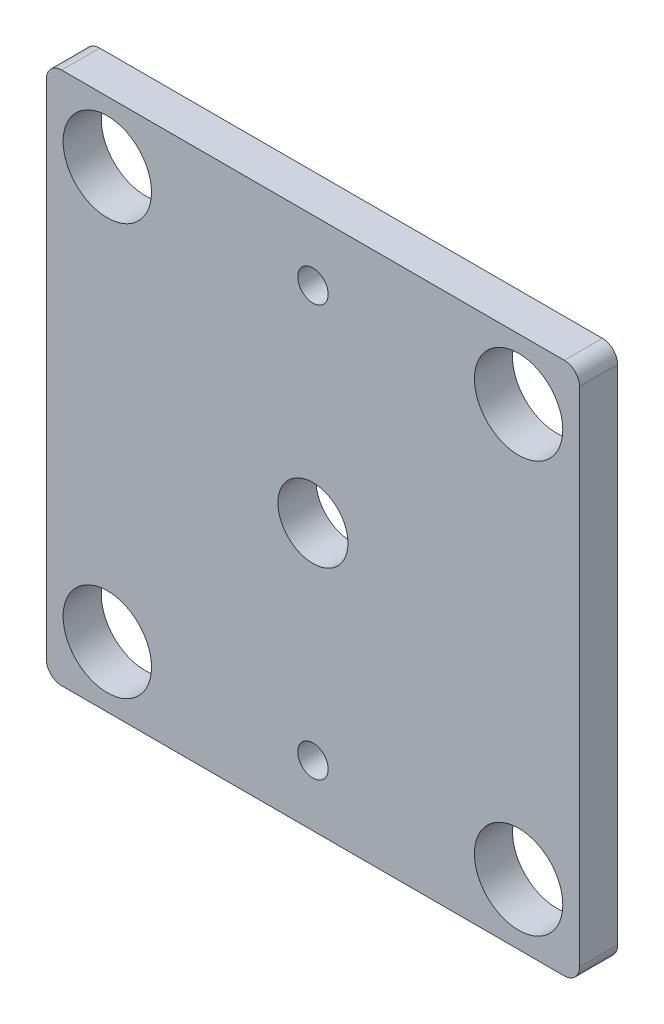
ISO-10303-21;
HEADER;
FILE_DESCRIPTION(('STEP AP214'),'2;1');
FILE_NAME('part.step','',(''),(''),'','','');
FILE_SCHEMA(('AUTOMOTIVE_DESIGN { 1 0 10303 214 1 1 1 1 }'));
ENDSEC;
DATA;
#1=APPLICATION_CONTEXT('core data for automotive mechanical design processes');
#2=APPLICATION_PROTOCOL_DEFINITION('international standard','automotive_design',2000,#1);
#3=PRODUCT_CONTEXT('',#1,'mechanical');
#4=PRODUCT('Part','Part','',(#3));
#5=PRODUCT_RELATED_PRODUCT_CATEGORY('part','',(#4));
#6=PRODUCT_DEFINITION_FORMATION('','',#4);
#7=PRODUCT_DEFINITION_CONTEXT('part definition',#1,'design');
#8=PRODUCT_DEFINITION('design','',#6,#7);
#9=PRODUCT_DEFINITION_SHAPE('','',#8);
#10=(LENGTH_UNIT() NAMED_UNIT(*) SI_UNIT(.MILLI.,.METRE.));
#11=(NAMED_UNIT(*) PLANE_ANGLE_UNIT() SI_UNIT($,.RADIAN.));
#12=(NAMED_UNIT(*) SI_UNIT($,.STERADIAN.) SOLID_ANGLE_UNIT());
#13=UNCERTAINTY_MEASURE_WITH_UNIT(LENGTH_MEASURE(1.E-05),#10,'distance_accuracy_value','');
#14=(GEOMETRIC_REPRESENTATION_CONTEXT(3) GLOBAL_UNCERTAINTY_ASSIGNED_CONTEXT((#13)) GLOBAL_UNIT_ASSIGNED_CONTEXT((#10,
#11,#12)) REPRESENTATION_CONTEXT('',''));
#15=CARTESIAN_POINT('',(0.,0.,0.));
#16=DIRECTION('',(0.,0.,1.));
#17=DIRECTION('',(1.,0.,0.));
#18=AXIS2_PLACEMENT_3D('',#15,#16,#17);
#19=CARTESIAN_POINT('',(0.,0.,5.));
#20=DIRECTION('',(0.,0.,1.));
#21=DIRECTION('',(1.,0.,0.));
#22=AXIS2_PLACEMENT_3D('',#19,#20,#21);
#23=PLANE('',#22);
#24=CARTESIAN_POINT('',(0.,0.,5.));
#25=DIRECTION('',(0.,0.,1.));
#26=DIRECTION('',(1.,0.,0.));
#27=AXIS2_PLACEMENT_3D('',#24,#25,#26);
#28=CIRCLE('',#27,4.6);
#29=CARTESIAN_POINT('',(4.6,0.,5.));
#30=VERTEX_POINT('',#29);
#31=EDGE_CURVE('E205',#30,#30,#28,.T.);
#32=ORIENTED_EDGE('',*,*,#31,.F.);
#33=EDGE_LOOP('',(#32));
#34=FACE_BOUND('',#33,.T.);
#35=CARTESIAN_POINT('',(-27.,-27.,5.));
#36=DIRECTION('',(0.,0.,1.));
#37=DIRECTION('',(1.,0.,0.));
#38=AXIS2_PLACEMENT_3D('',#35,#36,#37);
#39=CIRCLE('',#38,5.8);
#40=CARTESIAN_POINT('',(-21.2,-27.,5.));
#41=VERTEX_POINT('',#40);
#42=EDGE_CURVE('E193',#41,#41,#39,.T.);
#43=ORIENTED_EDGE('',*,*,#42,.F.);
#44=EDGE_LOOP('',(#43));
#45=FACE_BOUND('',#44,.T.);
#46=CARTESIAN_POINT('',(27.,27.,5.));
#47=DIRECTION('',(0.,0.,1.));
#48=DIRECTION('',(1.,0.,0.));
#49=AXIS2_PLACEMENT_3D('',#46,#47,#48);
#50=CIRCLE('',#49,5.8);
#51=CARTESIAN_POINT('',(32.8,27.,5.));
#52=VERTEX_POINT('',#51);
#53=EDGE_CURVE('E182',#52,#52,#50,.T.);
#54=ORIENTED_EDGE('',*,*,#53,.F.);
#55=EDGE_LOOP('',(#54));
#56=FACE_BOUND('',#55,.T.);
#57=DIRECTION('',(0.,-1.,0.));
#58=VECTOR('',#57,1.);
#59=CARTESIAN_POINT('',(-35.,-35.,5.));
#60=LINE('',#59,#58);
#61=CARTESIAN_POINT('',(-35.,33.,5.));
#62=VERTEX_POINT('',#61);
#63=CARTESIAN_POINT('',(-35.,-33.,5.));
#64=VERTEX_POINT('',#63);
#65=EDGE_CURVE('E130',#62,#64,#60,.T.);
#66=ORIENTED_EDGE('',*,*,#65,.T.);
#67=CARTESIAN_POINT('',(-33.,-33.,5.));
#68=DIRECTION('',(0.,0.,1.));
#69=DIRECTION('',(1.,0.,0.));
#70=AXIS2_PLACEMENT_3D('',#67,#68,#69);
#71=CIRCLE('',#70,2.);
#72=CARTESIAN_POINT('',(-33.,-35.,5.));
#73=VERTEX_POINT('',#72);
#74=EDGE_CURVE('E11',#64,#73,#71,.T.);
#75=ORIENTED_EDGE('',*,*,#74,.T.);
#76=DIRECTION('',(1.,0.,0.));
#77=VECTOR('',#76,1.);
#78=CARTESIAN_POINT('',(35.,-35.,5.));
#79=LINE('',#78,#77);
#80=CARTESIAN_POINT('',(33.,-35.,5.));
#81=VERTEX_POINT('',#80);
#82=EDGE_CURVE('E162',#73,#81,#79,.T.);
#83=ORIENTED_EDGE('',*,*,#82,.T.);
#84=CARTESIAN_POINT('',(33.,-33.,5.));
#85=DIRECTION('',(0.,0.,1.));
#86=DIRECTION('',(1.,0.,0.));
#87=AXIS2_PLACEMENT_3D('',#84,#85,#86);
#88=CIRCLE('',#87,2.);
#89=CARTESIAN_POINT('',(35.,-33.,5.));
#90=VERTEX_POINT('',#89);
#91=EDGE_CURVE('E145',#81,#90,#88,.T.);
#92=ORIENTED_EDGE('',*,*,#91,.T.);
#93=DIRECTION('',(0.,1.,0.));
#94=VECTOR('',#93,1.);
#95=CARTESIAN_POINT('',(35.,-35.,5.));
#96=LINE('',#95,#94);
#97=CARTESIAN_POINT('',(35.,33.,5.));
#98=VERTEX_POINT('',#97);
#99=EDGE_CURVE('E119',#90,#98,#96,.T.);
#100=ORIENTED_EDGE('',*,*,#99,.T.);
#101=CARTESIAN_POINT('',(33.,33.,5.));
#102=DIRECTION('',(0.,0.,1.));
#103=DIRECTION('',(1.,0.,0.));
#104=AXIS2_PLACEMENT_3D('',#101,#102,#103);
#105=CIRCLE('',#104,2.);
#106=CARTESIAN_POINT('',(33.,35.,5.));
#107=VERTEX_POINT('',#106);
#108=EDGE_CURVE('E143',#98,#107,#105,.T.);
#109=ORIENTED_EDGE('',*,*,#108,.T.);
#110=DIRECTION('',(-1.,0.,0.));
#111=VECTOR('',#110,1.);
#112=CARTESIAN_POINT('',(35.,35.,5.));
#113=LINE('',#112,#111);
#114=CARTESIAN_POINT('',(-33.,35.,5.));
#115=VERTEX_POINT('',#114);
#116=EDGE_CURVE('E136',#107,#115,#113,.T.);
#117=ORIENTED_EDGE('',*,*,#116,.T.);
#118=CARTESIAN_POINT('',(-33.,33.,5.));
#119=DIRECTION('',(0.,0.,1.));
#120=DIRECTION('',(1.,0.,0.));
#121=AXIS2_PLACEMENT_3D('',#118,#119,#120);
#122=CIRCLE('',#121,2.);
#123=EDGE_CURVE('E141',#115,#62,#122,.T.);
#124=ORIENTED_EDGE('',*,*,#123,.T.);
#125=EDGE_LOOP('',(#66,#75,#83,#92,#100,#109,#117,#124));
#126=FACE_BOUND('',#125,.T.);
#127=CARTESIAN_POINT('',(-27.,27.,5.));
#128=DIRECTION('',(0.,0.,1.));
#129=DIRECTION('',(1.,0.,0.));
#130=AXIS2_PLACEMENT_3D('',#127,#128,#129);
#131=CIRCLE('',#130,5.8);
#132=CARTESIAN_POINT('',(-21.2,27.,5.));
#133=VERTEX_POINT('',#132);
#134=EDGE_CURVE('E177',#133,#133,#131,.T.);
#135=ORIENTED_EDGE('',*,*,#134,.F.);
#136=EDGE_LOOP('',(#135));
#137=FACE_BOUND('',#136,.T.);
#138=CARTESIAN_POINT('',(27.,-27.,5.));
#139=DIRECTION('',(0.,0.,1.));
#140=DIRECTION('',(1.,0.,0.));
#141=AXIS2_PLACEMENT_3D('',#138,#139,#140);
#142=CIRCLE('',#141,5.8);
#143=CARTESIAN_POINT('',(32.8,-27.,5.));
#144=VERTEX_POINT('',#143);
#145=EDGE_CURVE('E187',#144,#144,#142,.T.);
#146=ORIENTED_EDGE('',*,*,#145,.F.);
#147=EDGE_LOOP('',(#146));
#148=FACE_BOUND('',#147,.T.);
#149=CARTESIAN_POINT('',(0.,27.,5.));
#150=DIRECTION('',(0.,0.,1.));
#151=DIRECTION('',(1.,0.,0.));
#152=AXIS2_PLACEMENT_3D('',#149,#150,#151);
#153=CIRCLE('',#152,2.);
#154=CARTESIAN_POINT('',(2.,27.,5.));
#155=VERTEX_POINT('',#154);
#156=EDGE_CURVE('E199',#155,#155,#153,.T.);
#157=ORIENTED_EDGE('',*,*,#156,.F.);
#158=EDGE_LOOP('',(#157));
#159=FACE_BOUND('',#158,.T.);
#160=CARTESIAN_POINT('',(0.,-27.,5.));
#161=DIRECTION('',(0.,0.,1.));
#162=DIRECTION('',(1.,0.,0.));
#163=AXIS2_PLACEMENT_3D('',#160,#161,#162);
#164=CIRCLE('',#163,2.);
#165=CARTESIAN_POINT('',(2.,-27.,5.));
#166=VERTEX_POINT('',#165);
#167=EDGE_CURVE('E211',#166,#166,#164,.T.);
#168=ORIENTED_EDGE('',*,*,#167,.F.);
#169=EDGE_LOOP('',(#168));
#170=FACE_BOUND('',#169,.T.);
#171=ADVANCED_FACE('F36',(#34,#45,#56,#126,#137,#148,#159,#170),#23,.T.);
#172=CARTESIAN_POINT('',(0.,0.,0.));
#173=DIRECTION('',(0.,0.,1.));
#174=DIRECTION('',(1.,0.,0.));
#175=AXIS2_PLACEMENT_3D('',#172,#173,#174);
#176=PLANE('',#175);
#177=DIRECTION('',(1.,0.,0.));
#178=VECTOR('',#177,1.);
#179=CARTESIAN_POINT('',(35.,-35.,0.));
#180=LINE('',#179,#178);
#181=CARTESIAN_POINT('',(-33.,-35.,0.));
#182=VERTEX_POINT('',#181);
#183=CARTESIAN_POINT('',(33.,-35.,0.));
#184=VERTEX_POINT('',#183);
#185=EDGE_CURVE('E127',#182,#184,#180,.T.);
#186=ORIENTED_EDGE('',*,*,#185,.F.);
#187=CARTESIAN_POINT('',(-33.,-33.,0.));
#188=DIRECTION('',(0.,0.,1.));
#189=DIRECTION('',(1.,0.,0.));
#190=AXIS2_PLACEMENT_3D('',#187,#188,#189);
#191=CIRCLE('',#190,2.);
#192=CARTESIAN_POINT('',(-35.,-33.,0.));
#193=VERTEX_POINT('',#192);
#194=EDGE_CURVE('E58',#182,#193,#191,.F.);
#195=ORIENTED_EDGE('',*,*,#194,.T.);
#196=DIRECTION('',(0.,-1.,0.));
#197=VECTOR('',#196,1.);
#198=CARTESIAN_POINT('',(-35.,-35.,0.));
#199=LINE('',#198,#197);
#200=CARTESIAN_POINT('',(-35.,33.,0.));
#201=VERTEX_POINT('',#200);
#202=EDGE_CURVE('E132',#201,#193,#199,.T.);
#203=ORIENTED_EDGE('',*,*,#202,.F.);
#204=CARTESIAN_POINT('',(-33.,33.,0.));
#205=DIRECTION('',(0.,0.,1.));
#206=DIRECTION('',(1.,0.,0.));
#207=AXIS2_PLACEMENT_3D('',#204,#205,#206);
#208=CIRCLE('',#207,2.);
#209=CARTESIAN_POINT('',(-33.,35.,0.));
#210=VERTEX_POINT('',#209);
#211=EDGE_CURVE('E120',#201,#210,#208,.F.);
#212=ORIENTED_EDGE('',*,*,#211,.T.);
#213=DIRECTION('',(-1.,0.,0.));
#214=VECTOR('',#213,1.);
#215=CARTESIAN_POINT('',(35.,35.,0.));
#216=LINE('',#215,#214);
#217=CARTESIAN_POINT('',(33.,35.,0.));
#218=VERTEX_POINT('',#217);
#219=EDGE_CURVE('E126',#218,#210,#216,.T.);
#220=ORIENTED_EDGE('',*,*,#219,.F.);
#221=CARTESIAN_POINT('',(33.,33.,0.));
#222=DIRECTION('',(0.,0.,1.));
#223=DIRECTION('',(1.,0.,0.));
#224=AXIS2_PLACEMENT_3D('',#221,#222,#223);
#225=CIRCLE('',#224,2.);
#226=CARTESIAN_POINT('',(35.,33.,0.));
#227=VERTEX_POINT('',#226);
#228=EDGE_CURVE('E110',#218,#227,#225,.F.);
#229=ORIENTED_EDGE('',*,*,#228,.T.);
#230=DIRECTION('',(0.,1.,0.));
#231=VECTOR('',#230,1.);
#232=CARTESIAN_POINT('',(35.,-35.,0.));
#233=LINE('',#232,#231);
#234=CARTESIAN_POINT('',(35.,-33.,0.));
#235=VERTEX_POINT('',#234);
#236=EDGE_CURVE('E116',#235,#227,#233,.T.);
#237=ORIENTED_EDGE('',*,*,#236,.F.);
#238=CARTESIAN_POINT('',(33.,-33.,0.));
#239=DIRECTION('',(0.,0.,1.));
#240=DIRECTION('',(1.,0.,0.));
#241=AXIS2_PLACEMENT_3D('',#238,#239,#240);
#242=CIRCLE('',#241,2.);
#243=EDGE_CURVE('E102',#235,#184,#242,.F.);
#244=ORIENTED_EDGE('',*,*,#243,.T.);
#245=EDGE_LOOP('',(#186,#195,#203,#212,#220,#229,#237,#244));
#246=FACE_BOUND('',#245,.T.);
#247=CARTESIAN_POINT('',(-27.,27.,0.));
#248=DIRECTION('',(0.,0.,1.));
#249=DIRECTION('',(1.,0.,0.));
#250=AXIS2_PLACEMENT_3D('',#247,#248,#249);
#251=CIRCLE('',#250,5.8);
#252=CARTESIAN_POINT('',(-21.2,27.,0.));
#253=VERTEX_POINT('',#252);
#254=EDGE_CURVE('E173',#253,#253,#251,.T.);
#255=ORIENTED_EDGE('',*,*,#254,.T.);
#256=EDGE_LOOP('',(#255));
#257=FACE_BOUND('',#256,.T.);
#258=CARTESIAN_POINT('',(27.,27.,0.));
#259=DIRECTION('',(0.,0.,1.));
#260=DIRECTION('',(1.,0.,0.));
#261=AXIS2_PLACEMENT_3D('',#258,#259,#260);
#262=CIRCLE('',#261,5.8);
#263=CARTESIAN_POINT('',(32.8,27.,0.));
#264=VERTEX_POINT('',#263);
#265=EDGE_CURVE('E184',#264,#264,#262,.T.);
#266=ORIENTED_EDGE('',*,*,#265,.T.);
#267=EDGE_LOOP('',(#266));
#268=FACE_BOUND('',#267,.T.);
#269=CARTESIAN_POINT('',(27.,-27.,0.));
#270=DIRECTION('',(0.,0.,1.));
#271=DIRECTION('',(1.,0.,0.));
#272=AXIS2_PLACEMENT_3D('',#269,#270,#271);
#273=CIRCLE('',#272,5.8);
#274=CARTESIAN_POINT('',(32.8,-27.,0.));
#275=VERTEX_POINT('',#274);
#276=EDGE_CURVE('E190',#275,#275,#273,.T.);
#277=ORIENTED_EDGE('',*,*,#276,.T.);
#278=EDGE_LOOP('',(#277));
#279=FACE_BOUND('',#278,.T.);
#280=CARTESIAN_POINT('',(-27.,-27.,0.));
#281=DIRECTION('',(0.,0.,1.));
#282=DIRECTION('',(1.,0.,0.));
#283=AXIS2_PLACEMENT_3D('',#280,#281,#282);
#284=CIRCLE('',#283,5.8);
#285=CARTESIAN_POINT('',(-21.2,-27.,0.));
#286=VERTEX_POINT('',#285);
#287=EDGE_CURVE('E196',#286,#286,#284,.T.);
#288=ORIENTED_EDGE('',*,*,#287,.T.);
#289=EDGE_LOOP('',(#288));
#290=FACE_BOUND('',#289,.T.);
#291=CARTESIAN_POINT('',(0.,27.,0.));
#292=DIRECTION('',(0.,0.,1.));
#293=DIRECTION('',(1.,0.,0.));
#294=AXIS2_PLACEMENT_3D('',#291,#292,#293);
#295=CIRCLE('',#294,2.);
#296=CARTESIAN_POINT('',(2.,27.,0.));
#297=VERTEX_POINT('',#296);
#298=EDGE_CURVE('E202',#297,#297,#295,.T.);
#299=ORIENTED_EDGE('',*,*,#298,.T.);
#300=EDGE_LOOP('',(#299));
#301=FACE_BOUND('',#300,.T.);
#302=CARTESIAN_POINT('',(0.,0.,0.));
#303=DIRECTION('',(0.,0.,1.));
#304=DIRECTION('',(1.,0.,0.));
#305=AXIS2_PLACEMENT_3D('',#302,#303,#304);
#306=CIRCLE('',#305,4.6);
#307=CARTESIAN_POINT('',(4.6,0.,0.));
#308=VERTEX_POINT('',#307);
#309=EDGE_CURVE('E208',#308,#308,#306,.T.);
#310=ORIENTED_EDGE('',*,*,#309,.T.);
#311=EDGE_LOOP('',(#310));
#312=FACE_BOUND('',#311,.T.);
#313=CARTESIAN_POINT('',(0.,-27.,0.));
#314=DIRECTION('',(0.,0.,1.));
#315=DIRECTION('',(1.,0.,0.));
#316=AXIS2_PLACEMENT_3D('',#313,#314,#315);
#317=CIRCLE('',#316,2.);
#318=CARTESIAN_POINT('',(2.,-27.,0.));
#319=VERTEX_POINT('',#318);
#320=EDGE_CURVE('E214',#319,#319,#317,.T.);
#321=ORIENTED_EDGE('',*,*,#320,.T.);
#322=EDGE_LOOP('',(#321));
#323=FACE_BOUND('',#322,.T.);
#324=ADVANCED_FACE('F123',(#246,#257,#268,#279,#290,#301,#312,#323),#176,.F.);
#325=CARTESIAN_POINT('',(-35.,-35.,5.));
#326=DIRECTION('',(1.,0.,0.));
#327=DIRECTION('',(0.,0.,-1.));
#328=AXIS2_PLACEMENT_3D('',#325,#326,#327);
#329=PLANE('',#328);
#330=ORIENTED_EDGE('',*,*,#202,.T.);
#331=DIRECTION('',(0.,0.,-1.));
#332=VECTOR('',#331,1.);
#333=CARTESIAN_POINT('',(-35.,-33.,5.));
#334=LINE('',#333,#332);
#335=EDGE_CURVE('E44',#193,#64,#334,.F.);
#336=ORIENTED_EDGE('',*,*,#335,.T.);
#337=ORIENTED_EDGE('',*,*,#65,.F.);
#338=DIRECTION('',(0.,0.,-1.));
#339=VECTOR('',#338,1.);
#340=CARTESIAN_POINT('',(-35.,33.,5.));
#341=LINE('',#340,#339);
#342=EDGE_CURVE('E152',#62,#201,#341,.T.);
#343=ORIENTED_EDGE('',*,*,#342,.T.);
#344=EDGE_LOOP('',(#330,#336,#337,#343));
#345=FACE_BOUND('',#344,.T.);
#346=ADVANCED_FACE('F229',(#345),#329,.F.);
#347=CARTESIAN_POINT('',(35.,-35.,5.));
#348=DIRECTION('',(0.,1.,0.));
#349=DIRECTION('',(-1.,0.,0.));
#350=AXIS2_PLACEMENT_3D('',#347,#348,#349);
#351=PLANE('',#350);
#352=ORIENTED_EDGE('',*,*,#82,.F.);
#353=DIRECTION('',(0.,0.,-1.));
#354=VECTOR('',#353,1.);
#355=CARTESIAN_POINT('',(-33.,-35.,5.));
#356=LINE('',#355,#354);
#357=EDGE_CURVE('E155',#73,#182,#356,.T.);
#358=ORIENTED_EDGE('',*,*,#357,.T.);
#359=ORIENTED_EDGE('',*,*,#185,.T.);
#360=DIRECTION('',(0.,0.,-1.));
#361=VECTOR('',#360,1.);
#362=CARTESIAN_POINT('',(33.,-35.,5.));
#363=LINE('',#362,#361);
#364=EDGE_CURVE('E108',#184,#81,#363,.F.);
#365=ORIENTED_EDGE('',*,*,#364,.T.);
#366=EDGE_LOOP('',(#352,#358,#359,#365));
#367=FACE_BOUND('',#366,.T.);
#368=ADVANCED_FACE('F161',(#367),#351,.F.);
#369=CARTESIAN_POINT('',(35.,-35.,5.));
#370=DIRECTION('',(-1.,0.,0.));
#371=DIRECTION('',(0.,0.,1.));
#372=AXIS2_PLACEMENT_3D('',#369,#370,#371);
#373=PLANE('',#372);
#374=ORIENTED_EDGE('',*,*,#99,.F.);
#375=DIRECTION('',(0.,0.,-1.));
#376=VECTOR('',#375,1.);
#377=CARTESIAN_POINT('',(35.,-33.,5.));
#378=LINE('',#377,#376);
#379=EDGE_CURVE('E106',#90,#235,#378,.T.);
#380=ORIENTED_EDGE('',*,*,#379,.T.);
#381=ORIENTED_EDGE('',*,*,#236,.T.);
#382=DIRECTION('',(0.,0.,-1.));
#383=VECTOR('',#382,1.);
#384=CARTESIAN_POINT('',(35.,33.,5.));
#385=LINE('',#384,#383);
#386=EDGE_CURVE('E121',#227,#98,#385,.F.);
#387=ORIENTED_EDGE('',*,*,#386,.T.);
#388=EDGE_LOOP('',(#374,#380,#381,#387));
#389=FACE_BOUND('',#388,.T.);
#390=ADVANCED_FACE('F115',(#389),#373,.F.);
#391=CARTESIAN_POINT('',(35.,35.,5.));
#392=DIRECTION('',(0.,-1.,0.));
#393=DIRECTION('',(1.,0.,0.));
#394=AXIS2_PLACEMENT_3D('',#391,#392,#393);
#395=PLANE('',#394);
#396=ORIENTED_EDGE('',*,*,#116,.F.);
#397=DIRECTION('',(0.,0.,-1.));
#398=VECTOR('',#397,1.);
#399=CARTESIAN_POINT('',(33.,35.,5.));
#400=LINE('',#399,#398);
#401=EDGE_CURVE('E149',#107,#218,#400,.T.);
#402=ORIENTED_EDGE('',*,*,#401,.T.);
#403=ORIENTED_EDGE('',*,*,#219,.T.);
#404=DIRECTION('',(0.,0.,-1.));
#405=VECTOR('',#404,1.);
#406=CARTESIAN_POINT('',(-33.,35.,5.));
#407=LINE('',#406,#405);
#408=EDGE_CURVE('E147',#210,#115,#407,.F.);
#409=ORIENTED_EDGE('',*,*,#408,.T.);
#410=EDGE_LOOP('',(#396,#402,#403,#409));
#411=FACE_BOUND('',#410,.T.);
#412=ADVANCED_FACE('F237',(#411),#395,.F.);
#413=CARTESIAN_POINT('',(-27.,27.,5.));
#414=DIRECTION('',(0.,0.,-1.));
#415=DIRECTION('',(-1.,0.,0.));
#416=AXIS2_PLACEMENT_3D('',#413,#414,#415);
#417=CYLINDRICAL_SURFACE('',#416,5.8);
#418=ORIENTED_EDGE('',*,*,#134,.T.);
#419=EDGE_LOOP('',(#418));
#420=FACE_BOUND('',#419,.T.);
#421=ORIENTED_EDGE('',*,*,#254,.F.);
#422=EDGE_LOOP('',(#421));
#423=FACE_BOUND('',#422,.T.);
#424=ADVANCED_FACE('F234',(#420,#423),#417,.F.);
#425=CARTESIAN_POINT('',(27.,27.,5.));
#426=DIRECTION('',(0.,0.,-1.));
#427=DIRECTION('',(-1.,0.,0.));
#428=AXIS2_PLACEMENT_3D('',#425,#426,#427);
#429=CYLINDRICAL_SURFACE('',#428,5.8);
#430=ORIENTED_EDGE('',*,*,#53,.T.);
#431=EDGE_LOOP('',(#430));
#432=FACE_BOUND('',#431,.T.);
#433=ORIENTED_EDGE('',*,*,#265,.F.);
#434=EDGE_LOOP('',(#433));
#435=FACE_BOUND('',#434,.T.);
#436=ADVANCED_FACE('F364',(#432,#435),#429,.F.);
#437=CARTESIAN_POINT('',(27.,-27.,5.));
#438=DIRECTION('',(0.,0.,-1.));
#439=DIRECTION('',(-1.,0.,0.));
#440=AXIS2_PLACEMENT_3D('',#437,#438,#439);
#441=CYLINDRICAL_SURFACE('',#440,5.8);
#442=ORIENTED_EDGE('',*,*,#145,.T.);
#443=EDGE_LOOP('',(#442));
#444=FACE_BOUND('',#443,.T.);
#445=ORIENTED_EDGE('',*,*,#276,.F.);
#446=EDGE_LOOP('',(#445));
#447=FACE_BOUND('',#446,.T.);
#448=ADVANCED_FACE('F354',(#444,#447),#441,.F.);
#449=CARTESIAN_POINT('',(-27.,-27.,5.));
#450=DIRECTION('',(0.,0.,-1.));
#451=DIRECTION('',(-1.,0.,0.));
#452=AXIS2_PLACEMENT_3D('',#449,#450,#451);
#453=CYLINDRICAL_SURFACE('',#452,5.8);
#454=ORIENTED_EDGE('',*,*,#42,.T.);
#455=EDGE_LOOP('',(#454));
#456=FACE_BOUND('',#455,.T.);
#457=ORIENTED_EDGE('',*,*,#287,.F.);
#458=EDGE_LOOP('',(#457));
#459=FACE_BOUND('',#458,.T.);
#460=ADVANCED_FACE('F344',(#456,#459),#453,.F.);
#461=CARTESIAN_POINT('',(0.,27.,5.));
#462=DIRECTION('',(0.,0.,-1.));
#463=DIRECTION('',(-1.,0.,0.));
#464=AXIS2_PLACEMENT_3D('',#461,#462,#463);
#465=CYLINDRICAL_SURFACE('',#464,2.);
#466=ORIENTED_EDGE('',*,*,#156,.T.);
#467=EDGE_LOOP('',(#466));
#468=FACE_BOUND('',#467,.T.);
#469=ORIENTED_EDGE('',*,*,#298,.F.);
#470=EDGE_LOOP('',(#469));
#471=FACE_BOUND('',#470,.T.);
#472=ADVANCED_FACE('F334',(#468,#471),#465,.F.);
#473=CARTESIAN_POINT('',(0.,0.,5.));
#474=DIRECTION('',(0.,0.,-1.));
#475=DIRECTION('',(-1.,0.,0.));
#476=AXIS2_PLACEMENT_3D('',#473,#474,#475);
#477=CYLINDRICAL_SURFACE('',#476,4.6);
#478=ORIENTED_EDGE('',*,*,#31,.T.);
#479=EDGE_LOOP('',(#478));
#480=FACE_BOUND('',#479,.T.);
#481=ORIENTED_EDGE('',*,*,#309,.F.);
#482=EDGE_LOOP('',(#481));
#483=FACE_BOUND('',#482,.T.);
#484=ADVANCED_FACE('F325',(#480,#483),#477,.F.);
#485=CARTESIAN_POINT('',(0.,-27.,5.));
#486=DIRECTION('',(0.,0.,-1.));
#487=DIRECTION('',(-1.,0.,0.));
#488=AXIS2_PLACEMENT_3D('',#485,#486,#487);
#489=CYLINDRICAL_SURFACE('',#488,2.);
#490=ORIENTED_EDGE('',*,*,#167,.T.);
#491=EDGE_LOOP('',(#490));
#492=FACE_BOUND('',#491,.T.);
#493=ORIENTED_EDGE('',*,*,#320,.F.);
#494=EDGE_LOOP('',(#493));
#495=FACE_BOUND('',#494,.T.);
#496=ADVANCED_FACE('F220',(#492,#495),#489,.F.);
#497=CARTESIAN_POINT('',(33.,-33.,5.));
#498=DIRECTION('',(0.,0.,-1.));
#499=DIRECTION('',(-1.,0.,0.));
#500=AXIS2_PLACEMENT_3D('',#497,#498,#499);
#501=CYLINDRICAL_SURFACE('',#500,2.);
#502=ORIENTED_EDGE('',*,*,#91,.F.);
#503=ORIENTED_EDGE('',*,*,#364,.F.);
#504=ORIENTED_EDGE('',*,*,#243,.F.);
#505=ORIENTED_EDGE('',*,*,#379,.F.);
#506=EDGE_LOOP('',(#502,#503,#504,#505));
#507=FACE_BOUND('',#506,.T.);
#508=ADVANCED_FACE('F105',(#507),#501,.T.);
#509=CARTESIAN_POINT('',(33.,33.,5.));
#510=DIRECTION('',(0.,0.,-1.));
#511=DIRECTION('',(-1.,0.,0.));
#512=AXIS2_PLACEMENT_3D('',#509,#510,#511);
#513=CYLINDRICAL_SURFACE('',#512,2.);
#514=ORIENTED_EDGE('',*,*,#108,.F.);
#515=ORIENTED_EDGE('',*,*,#386,.F.);
#516=ORIENTED_EDGE('',*,*,#228,.F.);
#517=ORIENTED_EDGE('',*,*,#401,.F.);
#518=EDGE_LOOP('',(#514,#515,#516,#517));
#519=FACE_BOUND('',#518,.T.);
#520=ADVANCED_FACE('F249',(#519),#513,.T.);
#521=CARTESIAN_POINT('',(-33.,33.,5.));
#522=DIRECTION('',(0.,0.,-1.));
#523=DIRECTION('',(-1.,0.,0.));
#524=AXIS2_PLACEMENT_3D('',#521,#522,#523);
#525=CYLINDRICAL_SURFACE('',#524,2.);
#526=ORIENTED_EDGE('',*,*,#123,.F.);
#527=ORIENTED_EDGE('',*,*,#408,.F.);
#528=ORIENTED_EDGE('',*,*,#211,.F.);
#529=ORIENTED_EDGE('',*,*,#342,.F.);
#530=EDGE_LOOP('',(#526,#527,#528,#529));
#531=FACE_BOUND('',#530,.T.);
#532=ADVANCED_FACE('F251',(#531),#525,.T.);
#533=CARTESIAN_POINT('',(-33.,-33.,5.));
#534=DIRECTION('',(0.,0.,-1.));
#535=DIRECTION('',(-1.,0.,0.));
#536=AXIS2_PLACEMENT_3D('',#533,#534,#535);
#537=CYLINDRICAL_SURFACE('',#536,2.);
#538=ORIENTED_EDGE('',*,*,#74,.F.);
#539=ORIENTED_EDGE('',*,*,#335,.F.);
#540=ORIENTED_EDGE('',*,*,#194,.F.);
#541=ORIENTED_EDGE('',*,*,#357,.F.);
#542=EDGE_LOOP('',(#538,#539,#540,#541));
#543=FACE_BOUND('',#542,.T.);
#544=ADVANCED_FACE('F38',(#543),#537,.T.);
#545=CLOSED_SHELL('',(#171,#324,#346,#368,#390,#412,#424,#436,#448,#460,#472,#484,#496,#508,
#520,#532,#544));
#546=MANIFOLD_SOLID_BREP('B2',#545);
#547=ADVANCED_BREP_SHAPE_REPRESENTATION('',(#18,#546),#14);
#548=SHAPE_DEFINITION_REPRESENTATION(#9,#547);
ENDSEC;
END-ISO-10303-21;
